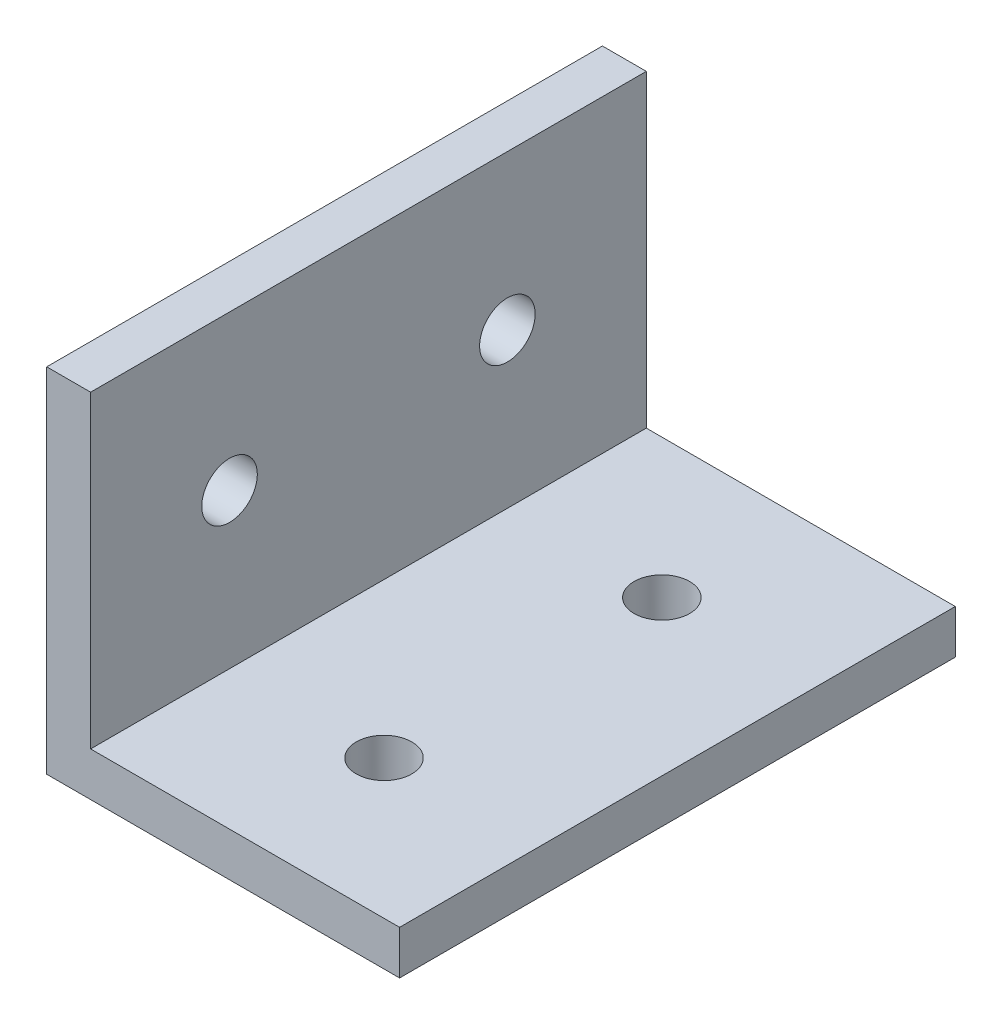
ISO-10303-21;
HEADER;
FILE_DESCRIPTION(('STEP AP214'),'2;1');
FILE_NAME('part.step','',(''),(''),'','','');
FILE_SCHEMA(('AUTOMOTIVE_DESIGN { 1 0 10303 214 1 1 1 1 }'));
ENDSEC;
DATA;
#1=APPLICATION_CONTEXT('core data for automotive mechanical design processes');
#2=APPLICATION_PROTOCOL_DEFINITION('international standard','automotive_design',2000,#1);
#3=PRODUCT_CONTEXT('',#1,'mechanical');
#4=PRODUCT('Part','Part','',(#3));
#5=PRODUCT_RELATED_PRODUCT_CATEGORY('part','',(#4));
#6=PRODUCT_DEFINITION_FORMATION('','',#4);
#7=PRODUCT_DEFINITION_CONTEXT('part definition',#1,'design');
#8=PRODUCT_DEFINITION('design','',#6,#7);
#9=PRODUCT_DEFINITION_SHAPE('','',#8);
#10=(LENGTH_UNIT() NAMED_UNIT(*) SI_UNIT(.MILLI.,.METRE.));
#11=(NAMED_UNIT(*) PLANE_ANGLE_UNIT() SI_UNIT($,.RADIAN.));
#12=(NAMED_UNIT(*) SI_UNIT($,.STERADIAN.) SOLID_ANGLE_UNIT());
#13=UNCERTAINTY_MEASURE_WITH_UNIT(LENGTH_MEASURE(1.E-05),#10,'distance_accuracy_value','');
#14=(GEOMETRIC_REPRESENTATION_CONTEXT(3) GLOBAL_UNCERTAINTY_ASSIGNED_CONTEXT((#13)) GLOBAL_UNIT_ASSIGNED_CONTEXT((#10,
#11,#12)) REPRESENTATION_CONTEXT('',''));
#15=CARTESIAN_POINT('',(0.,0.,0.));
#16=DIRECTION('',(0.,0.,1.));
#17=DIRECTION('',(1.,0.,0.));
#18=AXIS2_PLACEMENT_3D('',#15,#16,#17);
#19=CARTESIAN_POINT('',(0.,0.,-20.));
#20=DIRECTION('',(0.,1.,0.));
#21=DIRECTION('',(0.,0.,-1.));
#22=AXIS2_PLACEMENT_3D('',#19,#20,#21);
#23=PLANE('',#22);
#24=CARTESIAN_POINT('',(7.13999999999999,0.,-5.));
#25=DIRECTION('',(0.,-1.,0.));
#26=DIRECTION('',(0.,0.,-1.));
#27=AXIS2_PLACEMENT_3D('',#24,#25,#26);
#28=CIRCLE('',#27,1.);
#29=CARTESIAN_POINT('',(7.13999999999999,0.,-6.));
#30=VERTEX_POINT('',#29);
#31=EDGE_CURVE('E155',#30,#30,#28,.F.);
#32=ORIENTED_EDGE('',*,*,#31,.T.);
#33=EDGE_LOOP('',(#32));
#34=FACE_BOUND('',#33,.T.);
#35=CARTESIAN_POINT('',(7.13999999999999,0.,-15.));
#36=DIRECTION('',(0.,-1.,0.));
#37=DIRECTION('',(0.,0.,-1.));
#38=AXIS2_PLACEMENT_3D('',#35,#36,#37);
#39=CIRCLE('',#38,1.);
#40=CARTESIAN_POINT('',(7.13999999999999,0.,-16.));
#41=VERTEX_POINT('',#40);
#42=EDGE_CURVE('E160',#41,#41,#39,.F.);
#43=ORIENTED_EDGE('',*,*,#42,.T.);
#44=EDGE_LOOP('',(#43));
#45=FACE_BOUND('',#44,.T.);
#46=DIRECTION('',(1.,0.,0.));
#47=VECTOR('',#46,1.);
#48=CARTESIAN_POINT('',(0.,0.,0.));
#49=LINE('',#48,#47);
#50=CARTESIAN_POINT('',(0.,0.,0.));
#51=VERTEX_POINT('',#50);
#52=CARTESIAN_POINT('',(12.7,0.,0.));
#53=VERTEX_POINT('',#52);
#54=EDGE_CURVE('E120',#51,#53,#49,.T.);
#55=ORIENTED_EDGE('',*,*,#54,.F.);
#56=DIRECTION('',(0.,0.,1.));
#57=VECTOR('',#56,1.);
#58=CARTESIAN_POINT('',(0.,0.,-20.));
#59=LINE('',#58,#57);
#60=CARTESIAN_POINT('',(0.,0.,-20.));
#61=VERTEX_POINT('',#60);
#62=EDGE_CURVE('E119',#61,#51,#59,.T.);
#63=ORIENTED_EDGE('',*,*,#62,.F.);
#64=DIRECTION('',(1.,0.,0.));
#65=VECTOR('',#64,1.);
#66=CARTESIAN_POINT('',(0.,0.,-20.));
#67=LINE('',#66,#65);
#68=CARTESIAN_POINT('',(12.7,0.,-20.));
#69=VERTEX_POINT('',#68);
#70=EDGE_CURVE('E133',#61,#69,#67,.T.);
#71=ORIENTED_EDGE('',*,*,#70,.T.);
#72=DIRECTION('',(0.,0.,1.));
#73=VECTOR('',#72,1.);
#74=CARTESIAN_POINT('',(12.7,0.,-20.));
#75=LINE('',#74,#73);
#76=EDGE_CURVE('E11',#69,#53,#75,.T.);
#77=ORIENTED_EDGE('',*,*,#76,.T.);
#78=EDGE_LOOP('',(#55,#63,#71,#77));
#79=FACE_BOUND('',#78,.T.);
#80=ADVANCED_FACE('F37',(#34,#45,#79),#23,.F.);
#81=CARTESIAN_POINT('',(12.7,1.58,-20.));
#82=DIRECTION('',(-1.,0.,0.));
#83=DIRECTION('',(0.,0.,-1.));
#84=AXIS2_PLACEMENT_3D('',#81,#82,#83);
#85=PLANE('',#84);
#86=DIRECTION('',(0.,1.,0.));
#87=VECTOR('',#86,1.);
#88=CARTESIAN_POINT('',(12.7,1.58,0.));
#89=LINE('',#88,#87);
#90=CARTESIAN_POINT('',(12.7,1.58,0.));
#91=VERTEX_POINT('',#90);
#92=EDGE_CURVE('E122',#53,#91,#89,.T.);
#93=ORIENTED_EDGE('',*,*,#92,.F.);
#94=ORIENTED_EDGE('',*,*,#76,.F.);
#95=DIRECTION('',(0.,1.,0.));
#96=VECTOR('',#95,1.);
#97=CARTESIAN_POINT('',(12.7,1.58,-20.));
#98=LINE('',#97,#96);
#99=CARTESIAN_POINT('',(12.7,1.58,-20.));
#100=VERTEX_POINT('',#99);
#101=EDGE_CURVE('E85',#69,#100,#98,.T.);
#102=ORIENTED_EDGE('',*,*,#101,.T.);
#103=DIRECTION('',(0.,0.,1.));
#104=VECTOR('',#103,1.);
#105=CARTESIAN_POINT('',(12.7,1.58,-20.));
#106=LINE('',#105,#104);
#107=EDGE_CURVE('E45',#100,#91,#106,.T.);
#108=ORIENTED_EDGE('',*,*,#107,.T.);
#109=EDGE_LOOP('',(#93,#94,#102,#108));
#110=FACE_BOUND('',#109,.T.);
#111=ADVANCED_FACE('F139',(#110),#85,.F.);
#112=CARTESIAN_POINT('',(1.58,1.58,-20.));
#113=DIRECTION('',(0.,-1.,0.));
#114=DIRECTION('',(0.,0.,1.));
#115=AXIS2_PLACEMENT_3D('',#112,#113,#114);
#116=PLANE('',#115);
#117=CARTESIAN_POINT('',(7.14,1.58,-5.));
#118=DIRECTION('',(0.,1.,0.));
#119=DIRECTION('',(0.,0.,1.));
#120=AXIS2_PLACEMENT_3D('',#117,#118,#119);
#121=CIRCLE('',#120,1.);
#122=CARTESIAN_POINT('',(7.14,1.58,-4.));
#123=VERTEX_POINT('',#122);
#124=EDGE_CURVE('E163',#123,#123,#121,.F.);
#125=ORIENTED_EDGE('',*,*,#124,.T.);
#126=EDGE_LOOP('',(#125));
#127=FACE_BOUND('',#126,.T.);
#128=CARTESIAN_POINT('',(7.14,1.58,-15.));
#129=DIRECTION('',(0.,1.,0.));
#130=DIRECTION('',(0.,0.,1.));
#131=AXIS2_PLACEMENT_3D('',#128,#129,#130);
#132=CIRCLE('',#131,1.);
#133=CARTESIAN_POINT('',(7.14,1.58,-14.));
#134=VERTEX_POINT('',#133);
#135=EDGE_CURVE('E164',#134,#134,#132,.F.);
#136=ORIENTED_EDGE('',*,*,#135,.T.);
#137=EDGE_LOOP('',(#136));
#138=FACE_BOUND('',#137,.T.);
#139=DIRECTION('',(-1.,0.,0.));
#140=VECTOR('',#139,1.);
#141=CARTESIAN_POINT('',(1.58,1.58,0.));
#142=LINE('',#141,#140);
#143=CARTESIAN_POINT('',(1.58,1.58,0.));
#144=VERTEX_POINT('',#143);
#145=EDGE_CURVE('E126',#91,#144,#142,.T.);
#146=ORIENTED_EDGE('',*,*,#145,.F.);
#147=ORIENTED_EDGE('',*,*,#107,.F.);
#148=DIRECTION('',(-1.,0.,0.));
#149=VECTOR('',#148,1.);
#150=CARTESIAN_POINT('',(1.58,1.58,-20.));
#151=LINE('',#150,#149);
#152=CARTESIAN_POINT('',(1.58,1.58,-20.));
#153=VERTEX_POINT('',#152);
#154=EDGE_CURVE('E113',#100,#153,#151,.T.);
#155=ORIENTED_EDGE('',*,*,#154,.T.);
#156=DIRECTION('',(0.,0.,1.));
#157=VECTOR('',#156,1.);
#158=CARTESIAN_POINT('',(1.58,1.58,-20.));
#159=LINE('',#158,#157);
#160=EDGE_CURVE('E107',#153,#144,#159,.T.);
#161=ORIENTED_EDGE('',*,*,#160,.T.);
#162=EDGE_LOOP('',(#146,#147,#155,#161));
#163=FACE_BOUND('',#162,.T.);
#164=ADVANCED_FACE('F172',(#127,#138,#163),#116,.F.);
#165=CARTESIAN_POINT('',(1.58,1.58,-20.));
#166=DIRECTION('',(-1.,0.,0.));
#167=DIRECTION('',(0.,0.,-1.));
#168=AXIS2_PLACEMENT_3D('',#165,#166,#167);
#169=PLANE('',#168);
#170=CARTESIAN_POINT('',(1.58,7.14,-5.));
#171=DIRECTION('',(1.,0.,0.));
#172=DIRECTION('',(0.,0.,-1.));
#173=AXIS2_PLACEMENT_3D('',#170,#171,#172);
#174=CIRCLE('',#173,1.);
#175=CARTESIAN_POINT('',(1.58,7.14,-6.));
#176=VERTEX_POINT('',#175);
#177=EDGE_CURVE('E123',#176,#176,#174,.F.);
#178=ORIENTED_EDGE('',*,*,#177,.T.);
#179=EDGE_LOOP('',(#178));
#180=FACE_BOUND('',#179,.T.);
#181=CARTESIAN_POINT('',(1.58,7.14,-15.));
#182=DIRECTION('',(1.,0.,0.));
#183=DIRECTION('',(0.,0.,-1.));
#184=AXIS2_PLACEMENT_3D('',#181,#182,#183);
#185=CIRCLE('',#184,1.);
#186=CARTESIAN_POINT('',(1.58,7.14,-16.));
#187=VERTEX_POINT('',#186);
#188=EDGE_CURVE('E148',#187,#187,#185,.F.);
#189=ORIENTED_EDGE('',*,*,#188,.T.);
#190=EDGE_LOOP('',(#189));
#191=FACE_BOUND('',#190,.T.);
#192=DIRECTION('',(0.,1.,0.));
#193=VECTOR('',#192,1.);
#194=CARTESIAN_POINT('',(1.58,1.58,0.));
#195=LINE('',#194,#193);
#196=CARTESIAN_POINT('',(1.58,12.7,0.));
#197=VERTEX_POINT('',#196);
#198=EDGE_CURVE('E129',#144,#197,#195,.T.);
#199=ORIENTED_EDGE('',*,*,#198,.F.);
#200=ORIENTED_EDGE('',*,*,#160,.F.);
#201=DIRECTION('',(0.,1.,0.));
#202=VECTOR('',#201,1.);
#203=CARTESIAN_POINT('',(1.58,1.58,-20.));
#204=LINE('',#203,#202);
#205=CARTESIAN_POINT('',(1.58,12.7,-20.));
#206=VERTEX_POINT('',#205);
#207=EDGE_CURVE('E97',#153,#206,#204,.T.);
#208=ORIENTED_EDGE('',*,*,#207,.T.);
#209=DIRECTION('',(0.,0.,1.));
#210=VECTOR('',#209,1.);
#211=CARTESIAN_POINT('',(1.58,12.7,-20.));
#212=LINE('',#211,#210);
#213=EDGE_CURVE('E102',#206,#197,#212,.T.);
#214=ORIENTED_EDGE('',*,*,#213,.T.);
#215=EDGE_LOOP('',(#199,#200,#208,#214));
#216=FACE_BOUND('',#215,.T.);
#217=ADVANCED_FACE('F110',(#180,#191,#216),#169,.F.);
#218=CARTESIAN_POINT('',(0.,12.7,-20.));
#219=DIRECTION('',(0.,-1.,0.));
#220=DIRECTION('',(0.,0.,1.));
#221=AXIS2_PLACEMENT_3D('',#218,#219,#220);
#222=PLANE('',#221);
#223=DIRECTION('',(-1.,0.,0.));
#224=VECTOR('',#223,1.);
#225=CARTESIAN_POINT('',(0.,12.7,0.));
#226=LINE('',#225,#224);
#227=CARTESIAN_POINT('',(0.,12.7,0.));
#228=VERTEX_POINT('',#227);
#229=EDGE_CURVE('E104',#197,#228,#226,.T.);
#230=ORIENTED_EDGE('',*,*,#229,.F.);
#231=ORIENTED_EDGE('',*,*,#213,.F.);
#232=DIRECTION('',(-1.,0.,0.));
#233=VECTOR('',#232,1.);
#234=CARTESIAN_POINT('',(0.,12.7,-20.));
#235=LINE('',#234,#233);
#236=CARTESIAN_POINT('',(0.,12.7,-20.));
#237=VERTEX_POINT('',#236);
#238=EDGE_CURVE('E93',#206,#237,#235,.T.);
#239=ORIENTED_EDGE('',*,*,#238,.T.);
#240=DIRECTION('',(0.,0.,1.));
#241=VECTOR('',#240,1.);
#242=CARTESIAN_POINT('',(0.,12.7,-20.));
#243=LINE('',#242,#241);
#244=EDGE_CURVE('E108',#237,#228,#243,.T.);
#245=ORIENTED_EDGE('',*,*,#244,.T.);
#246=EDGE_LOOP('',(#230,#231,#239,#245));
#247=FACE_BOUND('',#246,.T.);
#248=ADVANCED_FACE('F103',(#247),#222,.F.);
#249=CARTESIAN_POINT('',(0.,0.,-20.));
#250=DIRECTION('',(1.,0.,0.));
#251=DIRECTION('',(0.,0.,1.));
#252=AXIS2_PLACEMENT_3D('',#249,#250,#251);
#253=PLANE('',#252);
#254=CARTESIAN_POINT('',(0.,7.14,-5.));
#255=DIRECTION('',(1.,0.,0.));
#256=DIRECTION('',(0.,0.,-1.));
#257=AXIS2_PLACEMENT_3D('',#254,#255,#256);
#258=CIRCLE('',#257,1.);
#259=CARTESIAN_POINT('',(0.,7.14,-6.));
#260=VERTEX_POINT('',#259);
#261=EDGE_CURVE('E151',#260,#260,#258,.T.);
#262=ORIENTED_EDGE('',*,*,#261,.T.);
#263=EDGE_LOOP('',(#262));
#264=FACE_BOUND('',#263,.T.);
#265=CARTESIAN_POINT('',(0.,7.14,-15.));
#266=DIRECTION('',(1.,0.,0.));
#267=DIRECTION('',(0.,0.,-1.));
#268=AXIS2_PLACEMENT_3D('',#265,#266,#267);
#269=CIRCLE('',#268,1.);
#270=CARTESIAN_POINT('',(0.,7.14,-16.));
#271=VERTEX_POINT('',#270);
#272=EDGE_CURVE('E152',#271,#271,#269,.T.);
#273=ORIENTED_EDGE('',*,*,#272,.T.);
#274=EDGE_LOOP('',(#273));
#275=FACE_BOUND('',#274,.T.);
#276=DIRECTION('',(0.,-1.,0.));
#277=VECTOR('',#276,1.);
#278=CARTESIAN_POINT('',(0.,0.,0.));
#279=LINE('',#278,#277);
#280=EDGE_CURVE('E73',#228,#51,#279,.T.);
#281=ORIENTED_EDGE('',*,*,#280,.F.);
#282=ORIENTED_EDGE('',*,*,#244,.F.);
#283=DIRECTION('',(0.,-1.,0.));
#284=VECTOR('',#283,1.);
#285=CARTESIAN_POINT('',(0.,0.,-20.));
#286=LINE('',#285,#284);
#287=EDGE_CURVE('E53',#237,#61,#286,.T.);
#288=ORIENTED_EDGE('',*,*,#287,.T.);
#289=ORIENTED_EDGE('',*,*,#62,.T.);
#290=EDGE_LOOP('',(#281,#282,#288,#289));
#291=FACE_BOUND('',#290,.T.);
#292=ADVANCED_FACE('F203',(#264,#275,#291),#253,.F.);
#293=CARTESIAN_POINT('',(0.,0.,-20.));
#294=DIRECTION('',(0.,0.,1.));
#295=DIRECTION('',(-1.,0.,0.));
#296=AXIS2_PLACEMENT_3D('',#293,#294,#295);
#297=PLANE('',#296);
#298=ORIENTED_EDGE('',*,*,#70,.F.);
#299=ORIENTED_EDGE('',*,*,#287,.F.);
#300=ORIENTED_EDGE('',*,*,#238,.F.);
#301=ORIENTED_EDGE('',*,*,#207,.F.);
#302=ORIENTED_EDGE('',*,*,#154,.F.);
#303=ORIENTED_EDGE('',*,*,#101,.F.);
#304=EDGE_LOOP('',(#298,#299,#300,#301,#302,#303));
#305=FACE_BOUND('',#304,.T.);
#306=ADVANCED_FACE('F95',(#305),#297,.F.);
#307=CARTESIAN_POINT('',(0.,0.,0.));
#308=DIRECTION('',(0.,0.,1.));
#309=DIRECTION('',(-1.,0.,0.));
#310=AXIS2_PLACEMENT_3D('',#307,#308,#309);
#311=PLANE('',#310);
#312=ORIENTED_EDGE('',*,*,#54,.T.);
#313=ORIENTED_EDGE('',*,*,#92,.T.);
#314=ORIENTED_EDGE('',*,*,#145,.T.);
#315=ORIENTED_EDGE('',*,*,#198,.T.);
#316=ORIENTED_EDGE('',*,*,#229,.T.);
#317=ORIENTED_EDGE('',*,*,#280,.T.);
#318=EDGE_LOOP('',(#312,#313,#314,#315,#316,#317));
#319=FACE_BOUND('',#318,.T.);
#320=ADVANCED_FACE('F141',(#319),#311,.T.);
#321=CARTESIAN_POINT('',(12.701,7.14,-15.));
#322=DIRECTION('',(-1.,0.,0.));
#323=DIRECTION('',(0.,0.,-1.));
#324=AXIS2_PLACEMENT_3D('',#321,#322,#323);
#325=CYLINDRICAL_SURFACE('',#324,1.);
#326=ORIENTED_EDGE('',*,*,#272,.F.);
#327=EDGE_LOOP('',(#326));
#328=FACE_BOUND('',#327,.T.);
#329=ORIENTED_EDGE('',*,*,#188,.F.);
#330=EDGE_LOOP('',(#329));
#331=FACE_BOUND('',#330,.T.);
#332=ADVANCED_FACE('F193',(#328,#331),#325,.F.);
#333=CARTESIAN_POINT('',(12.701,7.14,-5.));
#334=DIRECTION('',(-1.,0.,0.));
#335=DIRECTION('',(0.,0.,-1.));
#336=AXIS2_PLACEMENT_3D('',#333,#334,#335);
#337=CYLINDRICAL_SURFACE('',#336,1.);
#338=ORIENTED_EDGE('',*,*,#261,.F.);
#339=EDGE_LOOP('',(#338));
#340=FACE_BOUND('',#339,.T.);
#341=ORIENTED_EDGE('',*,*,#177,.F.);
#342=EDGE_LOOP('',(#341));
#343=FACE_BOUND('',#342,.T.);
#344=ADVANCED_FACE('F187',(#340,#343),#337,.F.);
#345=CARTESIAN_POINT('',(7.13999999999999,-0.00100000000002485,-15.));
#346=DIRECTION('',(0.,1.,0.));
#347=DIRECTION('',(-1.,0.,0.));
#348=AXIS2_PLACEMENT_3D('',#345,#346,#347);
#349=CYLINDRICAL_SURFACE('',#348,1.);
#350=ORIENTED_EDGE('',*,*,#135,.F.);
#351=EDGE_LOOP('',(#350));
#352=FACE_BOUND('',#351,.T.);
#353=ORIENTED_EDGE('',*,*,#42,.F.);
#354=EDGE_LOOP('',(#353));
#355=FACE_BOUND('',#354,.T.);
#356=ADVANCED_FACE('F178',(#352,#355),#349,.F.);
#357=CARTESIAN_POINT('',(7.13999999999999,-0.00100000000002485,-5.));
#358=DIRECTION('',(0.,1.,0.));
#359=DIRECTION('',(-1.,0.,0.));
#360=AXIS2_PLACEMENT_3D('',#357,#358,#359);
#361=CYLINDRICAL_SURFACE('',#360,1.);
#362=ORIENTED_EDGE('',*,*,#124,.F.);
#363=EDGE_LOOP('',(#362));
#364=FACE_BOUND('',#363,.T.);
#365=ORIENTED_EDGE('',*,*,#31,.F.);
#366=EDGE_LOOP('',(#365));
#367=FACE_BOUND('',#366,.T.);
#368=ADVANCED_FACE('F175',(#364,#367),#361,.F.);
#369=CLOSED_SHELL('',(#80,#111,#164,#217,#248,#292,#306,#320,#332,#344,#356,#368));
#370=MANIFOLD_SOLID_BREP('B2',#369);
#371=ADVANCED_BREP_SHAPE_REPRESENTATION('',(#18,#370),#14);
#372=SHAPE_DEFINITION_REPRESENTATION(#9,#371);
ENDSEC;
END-ISO-10303-21;
